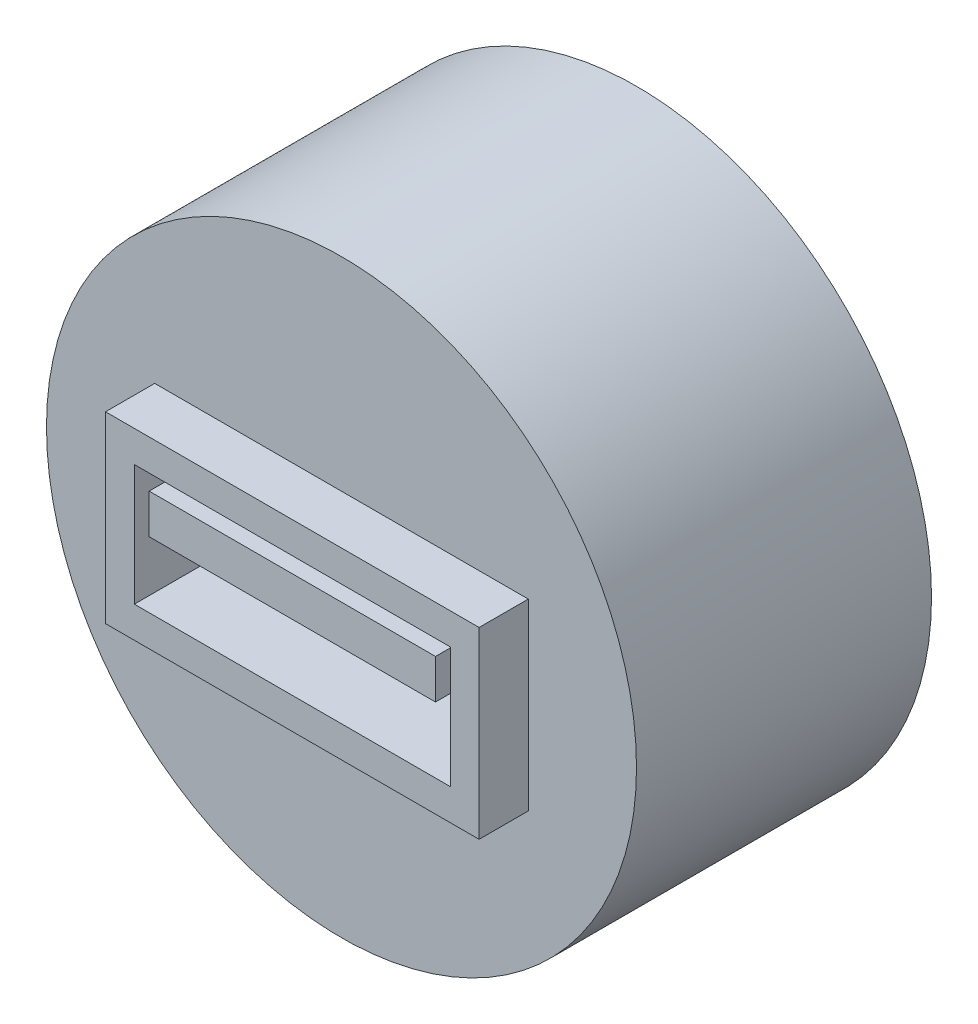
ISO-10303-21;
HEADER;
FILE_DESCRIPTION(('STEP AP214'),'2;1');
FILE_NAME('part.step','',(''),(''),'','','');
FILE_SCHEMA(('AUTOMOTIVE_DESIGN { 1 0 10303 214 1 1 1 1 }'));
ENDSEC;
DATA;
#1=APPLICATION_CONTEXT('core data for automotive mechanical design processes');
#2=APPLICATION_PROTOCOL_DEFINITION('international standard','automotive_design',2000,#1);
#3=PRODUCT_CONTEXT('',#1,'mechanical');
#4=PRODUCT('Part','Part','',(#3));
#5=PRODUCT_RELATED_PRODUCT_CATEGORY('part','',(#4));
#6=PRODUCT_DEFINITION_FORMATION('','',#4);
#7=PRODUCT_DEFINITION_CONTEXT('part definition',#1,'design');
#8=PRODUCT_DEFINITION('design','',#6,#7);
#9=PRODUCT_DEFINITION_SHAPE('','',#8);
#10=(LENGTH_UNIT() NAMED_UNIT(*) SI_UNIT(.MILLI.,.METRE.));
#11=(NAMED_UNIT(*) PLANE_ANGLE_UNIT() SI_UNIT($,.RADIAN.));
#12=(NAMED_UNIT(*) SI_UNIT($,.STERADIAN.) SOLID_ANGLE_UNIT());
#13=UNCERTAINTY_MEASURE_WITH_UNIT(LENGTH_MEASURE(1.E-05),#10,'distance_accuracy_value','');
#14=(GEOMETRIC_REPRESENTATION_CONTEXT(3) GLOBAL_UNCERTAINTY_ASSIGNED_CONTEXT((#13)) GLOBAL_UNIT_ASSIGNED_CONTEXT((#10,
#11,#12)) REPRESENTATION_CONTEXT('',''));
#15=CARTESIAN_POINT('',(0.,0.,0.));
#16=DIRECTION('',(0.,0.,1.));
#17=DIRECTION('',(1.,0.,0.));
#18=AXIS2_PLACEMENT_3D('',#15,#16,#17);
#19=CARTESIAN_POINT('',(0.,0.,12.));
#20=DIRECTION('',(0.,0.,1.));
#21=DIRECTION('',(1.,0.,0.));
#22=AXIS2_PLACEMENT_3D('',#19,#20,#21);
#23=PLANE('',#22);
#24=CARTESIAN_POINT('',(0.,0.,12.));
#25=DIRECTION('',(0.,0.,1.));
#26=DIRECTION('',(1.,0.,0.));
#27=AXIS2_PLACEMENT_3D('',#24,#25,#26);
#28=CIRCLE('',#27,12.);
#29=CARTESIAN_POINT('',(12.,0.,12.));
#30=VERTEX_POINT('',#29);
#31=EDGE_CURVE('E11',#30,#30,#28,.T.);
#32=ORIENTED_EDGE('',*,*,#31,.T.);
#33=EDGE_LOOP('',(#32));
#34=FACE_BOUND('',#33,.T.);
#35=DIRECTION('',(-1.,0.,0.));
#36=VECTOR('',#35,1.);
#37=CARTESIAN_POINT('',(-7.59760613697054,3.73186380736655,12.));
#38=LINE('',#37,#36);
#39=CARTESIAN_POINT('',(7.59760613697054,3.73186380736655,12.));
#40=VERTEX_POINT('',#39);
#41=CARTESIAN_POINT('',(-7.59760613697054,3.73186380736655,12.));
#42=VERTEX_POINT('',#41);
#43=EDGE_CURVE('E247',#40,#42,#38,.T.);
#44=ORIENTED_EDGE('',*,*,#43,.F.);
#45=DIRECTION('',(0.,1.,0.));
#46=VECTOR('',#45,1.);
#47=CARTESIAN_POINT('',(7.59760613697054,3.73186380736655,12.));
#48=LINE('',#47,#46);
#49=CARTESIAN_POINT('',(7.59760613697054,-3.73186380736655,12.));
#50=VERTEX_POINT('',#49);
#51=EDGE_CURVE('E228',#50,#40,#48,.T.);
#52=ORIENTED_EDGE('',*,*,#51,.F.);
#53=DIRECTION('',(1.,0.,0.));
#54=VECTOR('',#53,1.);
#55=CARTESIAN_POINT('',(-7.59760613697054,-3.73186380736655,12.));
#56=LINE('',#55,#54);
#57=CARTESIAN_POINT('',(-7.59760613697054,-3.73186380736655,12.));
#58=VERTEX_POINT('',#57);
#59=EDGE_CURVE('E234',#58,#50,#56,.T.);
#60=ORIENTED_EDGE('',*,*,#59,.F.);
#61=DIRECTION('',(0.,-1.,0.));
#62=VECTOR('',#61,1.);
#63=CARTESIAN_POINT('',(-7.59760613697054,3.73186380736655,12.));
#64=LINE('',#63,#62);
#65=EDGE_CURVE('E250',#42,#58,#64,.T.);
#66=ORIENTED_EDGE('',*,*,#65,.F.);
#67=EDGE_LOOP('',(#44,#52,#60,#66));
#68=FACE_BOUND('',#67,.T.);
#69=ADVANCED_FACE('F43',(#34,#68),#23,.T.);
#70=CARTESIAN_POINT('',(0.,0.,12.));
#71=DIRECTION('',(0.,0.,-1.));
#72=DIRECTION('',(-1.,0.,0.));
#73=AXIS2_PLACEMENT_3D('',#70,#71,#72);
#74=CYLINDRICAL_SURFACE('',#73,12.);
#75=ORIENTED_EDGE('',*,*,#31,.F.);
#76=EDGE_LOOP('',(#75));
#77=FACE_BOUND('',#76,.T.);
#78=CARTESIAN_POINT('',(0.,0.,0.));
#79=DIRECTION('',(0.,0.,1.));
#80=DIRECTION('',(1.,0.,0.));
#81=AXIS2_PLACEMENT_3D('',#78,#79,#80);
#82=CIRCLE('',#81,12.);
#83=CARTESIAN_POINT('',(12.,0.,0.));
#84=VERTEX_POINT('',#83);
#85=EDGE_CURVE('E47',#84,#84,#82,.T.);
#86=ORIENTED_EDGE('',*,*,#85,.T.);
#87=EDGE_LOOP('',(#86));
#88=FACE_BOUND('',#87,.T.);
#89=ADVANCED_FACE('F45',(#77,#88),#74,.T.);
#90=CARTESIAN_POINT('',(0.,0.,0.));
#91=DIRECTION('',(0.,0.,1.));
#92=DIRECTION('',(1.,0.,0.));
#93=AXIS2_PLACEMENT_3D('',#90,#91,#92);
#94=PLANE('',#93);
#95=ORIENTED_EDGE('',*,*,#85,.F.);
#96=EDGE_LOOP('',(#95));
#97=FACE_BOUND('',#96,.T.);
#98=ADVANCED_FACE('F273',(#97),#94,.F.);
#99=CARTESIAN_POINT('',(0.,0.,14.));
#100=DIRECTION('',(0.,0.,1.));
#101=DIRECTION('',(1.,0.,0.));
#102=AXIS2_PLACEMENT_3D('',#99,#100,#101);
#103=PLANE('',#102);
#104=DIRECTION('',(0.,1.,0.));
#105=VECTOR('',#104,1.);
#106=CARTESIAN_POINT('',(7.59760613697054,3.73186380736655,14.));
#107=LINE('',#106,#105);
#108=CARTESIAN_POINT('',(7.59760613697054,-3.73186380736655,14.));
#109=VERTEX_POINT('',#108);
#110=CARTESIAN_POINT('',(7.59760613697054,3.73186380736655,14.));
#111=VERTEX_POINT('',#110);
#112=EDGE_CURVE('E229',#109,#111,#107,.T.);
#113=ORIENTED_EDGE('',*,*,#112,.T.);
#114=DIRECTION('',(-1.,0.,0.));
#115=VECTOR('',#114,1.);
#116=CARTESIAN_POINT('',(-7.59760613697054,3.73186380736655,14.));
#117=LINE('',#116,#115);
#118=CARTESIAN_POINT('',(-7.59760613697054,3.73186380736655,14.));
#119=VERTEX_POINT('',#118);
#120=EDGE_CURVE('E233',#111,#119,#117,.T.);
#121=ORIENTED_EDGE('',*,*,#120,.T.);
#122=DIRECTION('',(0.,-1.,0.));
#123=VECTOR('',#122,1.);
#124=CARTESIAN_POINT('',(-7.59760613697054,3.73186380736655,14.));
#125=LINE('',#124,#123);
#126=CARTESIAN_POINT('',(-7.59760613697054,-3.73186380736655,14.));
#127=VERTEX_POINT('',#126);
#128=EDGE_CURVE('E237',#119,#127,#125,.T.);
#129=ORIENTED_EDGE('',*,*,#128,.T.);
#130=DIRECTION('',(1.,0.,0.));
#131=VECTOR('',#130,1.);
#132=CARTESIAN_POINT('',(-7.59760613697054,-3.73186380736655,14.));
#133=LINE('',#132,#131);
#134=EDGE_CURVE('E240',#127,#109,#133,.T.);
#135=ORIENTED_EDGE('',*,*,#134,.T.);
#136=EDGE_LOOP('',(#113,#121,#129,#135));
#137=FACE_BOUND('',#136,.T.);
#138=DIRECTION('',(-1.,0.,0.));
#139=VECTOR('',#138,1.);
#140=CARTESIAN_POINT('',(-6.42616906739359,2.46001784611156,14.));
#141=LINE('',#140,#139);
#142=CARTESIAN_POINT('',(6.42616906739359,2.46001784611156,14.));
#143=VERTEX_POINT('',#142);
#144=CARTESIAN_POINT('',(-6.42616906739359,2.46001784611156,14.));
#145=VERTEX_POINT('',#144);
#146=EDGE_CURVE('E208',#143,#145,#141,.T.);
#147=ORIENTED_EDGE('',*,*,#146,.F.);
#148=DIRECTION('',(0.,1.,0.));
#149=VECTOR('',#148,1.);
#150=CARTESIAN_POINT('',(6.42616906739359,2.46001784611156,14.));
#151=LINE('',#150,#149);
#152=CARTESIAN_POINT('',(6.42616906739359,-2.46001784611156,14.));
#153=VERTEX_POINT('',#152);
#154=EDGE_CURVE('E188',#153,#143,#151,.T.);
#155=ORIENTED_EDGE('',*,*,#154,.F.);
#156=DIRECTION('',(1.,0.,0.));
#157=VECTOR('',#156,1.);
#158=CARTESIAN_POINT('',(-6.42616906739359,-2.46001784611156,14.));
#159=LINE('',#158,#157);
#160=CARTESIAN_POINT('',(-6.42616906739359,-2.46001784611156,14.));
#161=VERTEX_POINT('',#160);
#162=EDGE_CURVE('E214',#161,#153,#159,.T.);
#163=ORIENTED_EDGE('',*,*,#162,.F.);
#164=DIRECTION('',(0.,-1.,0.));
#165=VECTOR('',#164,1.);
#166=CARTESIAN_POINT('',(-6.42616906739359,2.46001784611156,14.));
#167=LINE('',#166,#165);
#168=EDGE_CURVE('E211',#145,#161,#167,.T.);
#169=ORIENTED_EDGE('',*,*,#168,.F.);
#170=EDGE_LOOP('',(#147,#155,#163,#169));
#171=FACE_BOUND('',#170,.T.);
#172=ADVANCED_FACE('F275',(#137,#171),#103,.T.);
#173=CARTESIAN_POINT('',(7.59760613697054,3.73186380736655,14.));
#174=DIRECTION('',(-1.,0.,0.));
#175=DIRECTION('',(0.,0.,1.));
#176=AXIS2_PLACEMENT_3D('',#173,#174,#175);
#177=PLANE('',#176);
#178=ORIENTED_EDGE('',*,*,#51,.T.);
#179=DIRECTION('',(0.,0.,-1.));
#180=VECTOR('',#179,1.);
#181=CARTESIAN_POINT('',(7.59760613697054,3.73186380736655,14.));
#182=LINE('',#181,#180);
#183=EDGE_CURVE('E264',#111,#40,#182,.T.);
#184=ORIENTED_EDGE('',*,*,#183,.F.);
#185=ORIENTED_EDGE('',*,*,#112,.F.);
#186=DIRECTION('',(0.,0.,-1.));
#187=VECTOR('',#186,1.);
#188=CARTESIAN_POINT('',(7.59760613697054,-3.73186380736655,14.));
#189=LINE('',#188,#187);
#190=EDGE_CURVE('E243',#109,#50,#189,.T.);
#191=ORIENTED_EDGE('',*,*,#190,.T.);
#192=EDGE_LOOP('',(#178,#184,#185,#191));
#193=FACE_BOUND('',#192,.T.);
#194=ADVANCED_FACE('F280',(#193),#177,.F.);
#195=CARTESIAN_POINT('',(-7.59760613697054,3.73186380736655,14.));
#196=DIRECTION('',(0.,-1.,0.));
#197=DIRECTION('',(0.,0.,-1.));
#198=AXIS2_PLACEMENT_3D('',#195,#196,#197);
#199=PLANE('',#198);
#200=ORIENTED_EDGE('',*,*,#43,.T.);
#201=DIRECTION('',(0.,0.,-1.));
#202=VECTOR('',#201,1.);
#203=CARTESIAN_POINT('',(-7.59760613697054,3.73186380736655,14.));
#204=LINE('',#203,#202);
#205=EDGE_CURVE('E260',#119,#42,#204,.T.);
#206=ORIENTED_EDGE('',*,*,#205,.F.);
#207=ORIENTED_EDGE('',*,*,#120,.F.);
#208=ORIENTED_EDGE('',*,*,#183,.T.);
#209=EDGE_LOOP('',(#200,#206,#207,#208));
#210=FACE_BOUND('',#209,.T.);
#211=ADVANCED_FACE('F293',(#210),#199,.F.);
#212=CARTESIAN_POINT('',(-7.59760613697054,3.73186380736655,14.));
#213=DIRECTION('',(1.,0.,0.));
#214=DIRECTION('',(0.,0.,-1.));
#215=AXIS2_PLACEMENT_3D('',#212,#213,#214);
#216=PLANE('',#215);
#217=ORIENTED_EDGE('',*,*,#65,.T.);
#218=DIRECTION('',(0.,0.,-1.));
#219=VECTOR('',#218,1.);
#220=CARTESIAN_POINT('',(-7.59760613697054,-3.73186380736655,14.));
#221=LINE('',#220,#219);
#222=EDGE_CURVE('E59',#127,#58,#221,.T.);
#223=ORIENTED_EDGE('',*,*,#222,.F.);
#224=ORIENTED_EDGE('',*,*,#128,.F.);
#225=ORIENTED_EDGE('',*,*,#205,.T.);
#226=EDGE_LOOP('',(#217,#223,#224,#225));
#227=FACE_BOUND('',#226,.T.);
#228=ADVANCED_FACE('F297',(#227),#216,.F.);
#229=CARTESIAN_POINT('',(-7.59760613697054,-3.73186380736655,14.));
#230=DIRECTION('',(0.,1.,0.));
#231=DIRECTION('',(0.,0.,1.));
#232=AXIS2_PLACEMENT_3D('',#229,#230,#231);
#233=PLANE('',#232);
#234=ORIENTED_EDGE('',*,*,#59,.T.);
#235=ORIENTED_EDGE('',*,*,#190,.F.);
#236=ORIENTED_EDGE('',*,*,#134,.F.);
#237=ORIENTED_EDGE('',*,*,#222,.T.);
#238=EDGE_LOOP('',(#234,#235,#236,#237));
#239=FACE_BOUND('',#238,.T.);
#240=ADVANCED_FACE('F300',(#239),#233,.F.);
#241=CARTESIAN_POINT('',(6.42616906739359,2.46001784611156,14.));
#242=DIRECTION('',(-1.,0.,0.));
#243=DIRECTION('',(0.,0.,1.));
#244=AXIS2_PLACEMENT_3D('',#241,#242,#243);
#245=PLANE('',#244);
#246=DIRECTION('',(0.,0.,-1.));
#247=VECTOR('',#246,1.);
#248=CARTESIAN_POINT('',(6.42616906739359,2.46001784611156,14.));
#249=LINE('',#248,#247);
#250=CARTESIAN_POINT('',(6.42616906739359,2.46001784611156,10.));
#251=VERTEX_POINT('',#250);
#252=EDGE_CURVE('E225',#143,#251,#249,.T.);
#253=ORIENTED_EDGE('',*,*,#252,.T.);
#254=DIRECTION('',(0.,1.,0.));
#255=VECTOR('',#254,1.);
#256=CARTESIAN_POINT('',(6.42616906739359,-2.46001784611156,10.));
#257=LINE('',#256,#255);
#258=CARTESIAN_POINT('',(6.42616906739359,-2.46001784611156,10.));
#259=VERTEX_POINT('',#258);
#260=EDGE_CURVE('E172',#259,#251,#257,.T.);
#261=ORIENTED_EDGE('',*,*,#260,.F.);
#262=DIRECTION('',(0.,0.,-1.));
#263=VECTOR('',#262,1.);
#264=CARTESIAN_POINT('',(6.42616906739359,-2.46001784611156,14.));
#265=LINE('',#264,#263);
#266=EDGE_CURVE('E217',#153,#259,#265,.T.);
#267=ORIENTED_EDGE('',*,*,#266,.F.);
#268=ORIENTED_EDGE('',*,*,#154,.T.);
#269=EDGE_LOOP('',(#253,#261,#267,#268));
#270=FACE_BOUND('',#269,.T.);
#271=ADVANCED_FACE('F303',(#270),#245,.T.);
#272=CARTESIAN_POINT('',(-6.42616906739359,2.46001784611156,14.));
#273=DIRECTION('',(0.,-1.,0.));
#274=DIRECTION('',(0.,0.,-1.));
#275=AXIS2_PLACEMENT_3D('',#272,#273,#274);
#276=PLANE('',#275);
#277=DIRECTION('',(0.,0.,-1.));
#278=VECTOR('',#277,1.);
#279=CARTESIAN_POINT('',(-6.42616906739359,2.46001784611156,14.));
#280=LINE('',#279,#278);
#281=CARTESIAN_POINT('',(-6.42616906739359,2.46001784611156,10.));
#282=VERTEX_POINT('',#281);
#283=EDGE_CURVE('E222',#145,#282,#280,.T.);
#284=ORIENTED_EDGE('',*,*,#283,.T.);
#285=DIRECTION('',(-1.,0.,0.));
#286=VECTOR('',#285,1.);
#287=CARTESIAN_POINT('',(6.42616906739359,2.46001784611156,10.));
#288=LINE('',#287,#286);
#289=EDGE_CURVE('E176',#251,#282,#288,.T.);
#290=ORIENTED_EDGE('',*,*,#289,.F.);
#291=ORIENTED_EDGE('',*,*,#252,.F.);
#292=ORIENTED_EDGE('',*,*,#146,.T.);
#293=EDGE_LOOP('',(#284,#290,#291,#292));
#294=FACE_BOUND('',#293,.T.);
#295=ADVANCED_FACE('F307',(#294),#276,.T.);
#296=CARTESIAN_POINT('',(-6.42616906739359,2.46001784611156,14.));
#297=DIRECTION('',(1.,0.,0.));
#298=DIRECTION('',(0.,0.,-1.));
#299=AXIS2_PLACEMENT_3D('',#296,#297,#298);
#300=PLANE('',#299);
#301=DIRECTION('',(0.,0.,-1.));
#302=VECTOR('',#301,1.);
#303=CARTESIAN_POINT('',(-6.42616906739359,-2.46001784611156,14.));
#304=LINE('',#303,#302);
#305=CARTESIAN_POINT('',(-6.42616906739359,-2.46001784611156,10.));
#306=VERTEX_POINT('',#305);
#307=EDGE_CURVE('E67',#161,#306,#304,.T.);
#308=ORIENTED_EDGE('',*,*,#307,.T.);
#309=DIRECTION('',(0.,-1.,0.));
#310=VECTOR('',#309,1.);
#311=CARTESIAN_POINT('',(-6.42616906739359,2.46001784611156,10.));
#312=LINE('',#311,#310);
#313=EDGE_CURVE('E180',#282,#306,#312,.T.);
#314=ORIENTED_EDGE('',*,*,#313,.F.);
#315=ORIENTED_EDGE('',*,*,#283,.F.);
#316=ORIENTED_EDGE('',*,*,#168,.T.);
#317=EDGE_LOOP('',(#308,#314,#315,#316));
#318=FACE_BOUND('',#317,.T.);
#319=ADVANCED_FACE('F311',(#318),#300,.T.);
#320=CARTESIAN_POINT('',(-6.42616906739359,-2.46001784611156,14.));
#321=DIRECTION('',(0.,1.,0.));
#322=DIRECTION('',(0.,0.,1.));
#323=AXIS2_PLACEMENT_3D('',#320,#321,#322);
#324=PLANE('',#323);
#325=ORIENTED_EDGE('',*,*,#266,.T.);
#326=DIRECTION('',(1.,0.,0.));
#327=VECTOR('',#326,1.);
#328=CARTESIAN_POINT('',(-6.42616906739359,-2.46001784611156,10.));
#329=LINE('',#328,#327);
#330=EDGE_CURVE('E168',#306,#259,#329,.T.);
#331=ORIENTED_EDGE('',*,*,#330,.F.);
#332=ORIENTED_EDGE('',*,*,#307,.F.);
#333=ORIENTED_EDGE('',*,*,#162,.T.);
#334=EDGE_LOOP('',(#325,#331,#332,#333));
#335=FACE_BOUND('',#334,.T.);
#336=ADVANCED_FACE('F315',(#335),#324,.T.);
#337=CARTESIAN_POINT('',(0.,0.,10.));
#338=DIRECTION('',(0.,0.,1.));
#339=DIRECTION('',(1.,0.,0.));
#340=AXIS2_PLACEMENT_3D('',#337,#338,#339);
#341=PLANE('',#340);
#342=DIRECTION('',(-1.,0.,0.));
#343=VECTOR('',#342,1.);
#344=CARTESIAN_POINT('',(5.82371571732544,1.82409486548415,10.));
#345=LINE('',#344,#343);
#346=CARTESIAN_POINT('',(5.82371571732544,1.82409486548415,10.));
#347=VERTEX_POINT('',#346);
#348=CARTESIAN_POINT('',(-5.82371571732544,1.82409486548415,10.));
#349=VERTEX_POINT('',#348);
#350=EDGE_CURVE('E165',#347,#349,#345,.T.);
#351=ORIENTED_EDGE('',*,*,#350,.F.);
#352=DIRECTION('',(0.,1.,0.));
#353=VECTOR('',#352,1.);
#354=CARTESIAN_POINT('',(5.82371571732544,0.217552598635755,10.));
#355=LINE('',#354,#353);
#356=CARTESIAN_POINT('',(5.82371571732544,0.217552598635755,10.));
#357=VERTEX_POINT('',#356);
#358=EDGE_CURVE('E155',#357,#347,#355,.T.);
#359=ORIENTED_EDGE('',*,*,#358,.F.);
#360=DIRECTION('',(1.,0.,0.));
#361=VECTOR('',#360,1.);
#362=CARTESIAN_POINT('',(-5.82371571732544,0.217552598635755,10.));
#363=LINE('',#362,#361);
#364=CARTESIAN_POINT('',(-5.82371571732544,0.217552598635755,10.));
#365=VERTEX_POINT('',#364);
#366=EDGE_CURVE('E137',#365,#357,#363,.T.);
#367=ORIENTED_EDGE('',*,*,#366,.F.);
#368=DIRECTION('',(0.,-1.,0.));
#369=VECTOR('',#368,1.);
#370=CARTESIAN_POINT('',(-5.82371571732544,1.82409486548415,10.));
#371=LINE('',#370,#369);
#372=EDGE_CURVE('E152',#349,#365,#371,.T.);
#373=ORIENTED_EDGE('',*,*,#372,.F.);
#374=EDGE_LOOP('',(#351,#359,#367,#373));
#375=FACE_BOUND('',#374,.T.);
#376=ORIENTED_EDGE('',*,*,#330,.T.);
#377=ORIENTED_EDGE('',*,*,#260,.T.);
#378=ORIENTED_EDGE('',*,*,#289,.T.);
#379=ORIENTED_EDGE('',*,*,#313,.T.);
#380=EDGE_LOOP('',(#376,#377,#378,#379));
#381=FACE_BOUND('',#380,.T.);
#382=ADVANCED_FACE('F150',(#375,#381),#341,.T.);
#383=CARTESIAN_POINT('',(0.,0.,14.));
#384=DIRECTION('',(0.,0.,1.));
#385=DIRECTION('',(1.,0.,0.));
#386=AXIS2_PLACEMENT_3D('',#383,#384,#385);
#387=PLANE('',#386);
#388=DIRECTION('',(1.,0.,0.));
#389=VECTOR('',#388,1.);
#390=CARTESIAN_POINT('',(-5.82371571732544,0.217552598635755,14.));
#391=LINE('',#390,#389);
#392=CARTESIAN_POINT('',(-5.82371571732544,0.217552598635755,14.));
#393=VERTEX_POINT('',#392);
#394=CARTESIAN_POINT('',(5.82371571732544,0.217552598635755,14.));
#395=VERTEX_POINT('',#394);
#396=EDGE_CURVE('E139',#393,#395,#391,.T.);
#397=ORIENTED_EDGE('',*,*,#396,.T.);
#398=DIRECTION('',(0.,1.,0.));
#399=VECTOR('',#398,1.);
#400=CARTESIAN_POINT('',(5.82371571732544,1.82409486548415,14.));
#401=LINE('',#400,#399);
#402=CARTESIAN_POINT('',(5.82371571732544,1.82409486548415,14.));
#403=VERTEX_POINT('',#402);
#404=EDGE_CURVE('E193',#395,#403,#401,.T.);
#405=ORIENTED_EDGE('',*,*,#404,.T.);
#406=DIRECTION('',(-1.,0.,0.));
#407=VECTOR('',#406,1.);
#408=CARTESIAN_POINT('',(-5.82371571732544,1.82409486548415,14.));
#409=LINE('',#408,#407);
#410=CARTESIAN_POINT('',(-5.82371571732544,1.82409486548415,14.));
#411=VERTEX_POINT('',#410);
#412=EDGE_CURVE('E189',#403,#411,#409,.T.);
#413=ORIENTED_EDGE('',*,*,#412,.T.);
#414=DIRECTION('',(0.,-1.,0.));
#415=VECTOR('',#414,1.);
#416=CARTESIAN_POINT('',(-5.82371571732544,1.82409486548415,14.));
#417=LINE('',#416,#415);
#418=EDGE_CURVE('E185',#411,#393,#417,.T.);
#419=ORIENTED_EDGE('',*,*,#418,.T.);
#420=EDGE_LOOP('',(#397,#405,#413,#419));
#421=FACE_BOUND('',#420,.T.);
#422=ADVANCED_FACE('F319',(#421),#387,.T.);
#423=CARTESIAN_POINT('',(-5.82371571732544,1.82409486548415,25.7577054343126));
#424=DIRECTION('',(1.,0.,0.));
#425=DIRECTION('',(0.,0.,-1.));
#426=AXIS2_PLACEMENT_3D('',#423,#424,#425);
#427=PLANE('',#426);
#428=ORIENTED_EDGE('',*,*,#418,.F.);
#429=DIRECTION('',(0.,0.,-1.));
#430=VECTOR('',#429,1.);
#431=CARTESIAN_POINT('',(-5.82371571732544,1.82409486548415,25.7577054343126));
#432=LINE('',#431,#430);
#433=EDGE_CURVE('E144',#411,#349,#432,.T.);
#434=ORIENTED_EDGE('',*,*,#433,.T.);
#435=ORIENTED_EDGE('',*,*,#372,.T.);
#436=DIRECTION('',(0.,0.,-1.));
#437=VECTOR('',#436,1.);
#438=CARTESIAN_POINT('',(-5.82371571732544,0.217552598635755,25.7577054343126));
#439=LINE('',#438,#437);
#440=EDGE_CURVE('E134',#393,#365,#439,.T.);
#441=ORIENTED_EDGE('',*,*,#440,.F.);
#442=EDGE_LOOP('',(#428,#434,#435,#441));
#443=FACE_BOUND('',#442,.T.);
#444=ADVANCED_FACE('F158',(#443),#427,.F.);
#445=CARTESIAN_POINT('',(-5.82371571732544,0.217552598635755,25.7577054343126));
#446=DIRECTION('',(0.,1.,0.));
#447=DIRECTION('',(0.,0.,1.));
#448=AXIS2_PLACEMENT_3D('',#445,#446,#447);
#449=PLANE('',#448);
#450=ORIENTED_EDGE('',*,*,#396,.F.);
#451=ORIENTED_EDGE('',*,*,#440,.T.);
#452=ORIENTED_EDGE('',*,*,#366,.T.);
#453=DIRECTION('',(0.,0.,-1.));
#454=VECTOR('',#453,1.);
#455=CARTESIAN_POINT('',(5.82371571732544,0.217552598635755,25.7577054343126));
#456=LINE('',#455,#454);
#457=EDGE_CURVE('E184',#395,#357,#456,.T.);
#458=ORIENTED_EDGE('',*,*,#457,.F.);
#459=EDGE_LOOP('',(#450,#451,#452,#458));
#460=FACE_BOUND('',#459,.T.);
#461=ADVANCED_FACE('F136',(#460),#449,.F.);
#462=CARTESIAN_POINT('',(5.82371571732544,1.82409486548415,25.7577054343126));
#463=DIRECTION('',(-1.,0.,0.));
#464=DIRECTION('',(0.,0.,1.));
#465=AXIS2_PLACEMENT_3D('',#462,#463,#464);
#466=PLANE('',#465);
#467=ORIENTED_EDGE('',*,*,#404,.F.);
#468=ORIENTED_EDGE('',*,*,#457,.T.);
#469=ORIENTED_EDGE('',*,*,#358,.T.);
#470=DIRECTION('',(0.,0.,-1.));
#471=VECTOR('',#470,1.);
#472=CARTESIAN_POINT('',(5.82371571732544,1.82409486548415,25.7577054343126));
#473=LINE('',#472,#471);
#474=EDGE_CURVE('E199',#403,#347,#473,.T.);
#475=ORIENTED_EDGE('',*,*,#474,.F.);
#476=EDGE_LOOP('',(#467,#468,#469,#475));
#477=FACE_BOUND('',#476,.T.);
#478=ADVANCED_FACE('F323',(#477),#466,.F.);
#479=CARTESIAN_POINT('',(-5.82371571732544,1.82409486548415,25.7577054343126));
#480=DIRECTION('',(0.,-1.,0.));
#481=DIRECTION('',(0.,0.,-1.));
#482=AXIS2_PLACEMENT_3D('',#479,#480,#481);
#483=PLANE('',#482);
#484=ORIENTED_EDGE('',*,*,#412,.F.);
#485=ORIENTED_EDGE('',*,*,#474,.T.);
#486=ORIENTED_EDGE('',*,*,#350,.T.);
#487=ORIENTED_EDGE('',*,*,#433,.F.);
#488=EDGE_LOOP('',(#484,#485,#486,#487));
#489=FACE_BOUND('',#488,.T.);
#490=ADVANCED_FACE('F326',(#489),#483,.F.);
#491=CLOSED_SHELL('',(#69,#89,#98,#172,#194,#211,#228,#240,#271,#295,#319,#336,#382,#422,#444,
#461,#478,#490));
#492=MANIFOLD_SOLID_BREP('B2',#491);
#493=ADVANCED_BREP_SHAPE_REPRESENTATION('',(#18,#492),#14);
#494=SHAPE_DEFINITION_REPRESENTATION(#9,#493);
ENDSEC;
END-ISO-10303-21;
